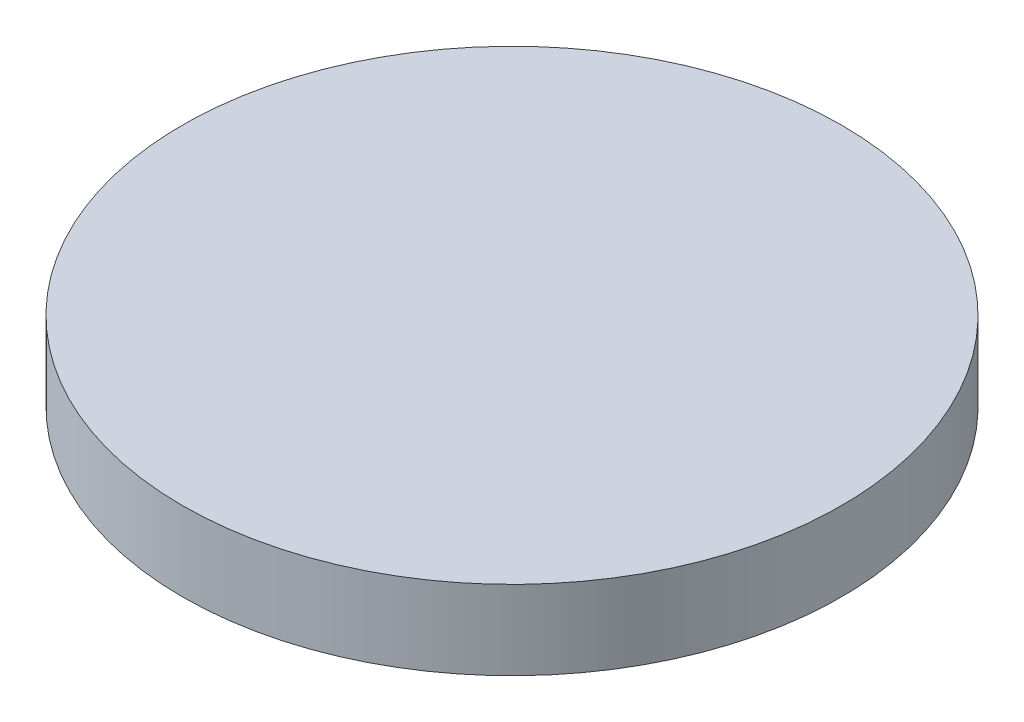
ISO-10303-21;
HEADER;
FILE_DESCRIPTION(('STEP AP214'),'2;1');
FILE_NAME('part.step','',(''),(''),'','','');
FILE_SCHEMA(('AUTOMOTIVE_DESIGN { 1 0 10303 214 1 1 1 1 }'));
ENDSEC;
DATA;
#1=APPLICATION_CONTEXT('core data for automotive mechanical design processes');
#2=APPLICATION_PROTOCOL_DEFINITION('international standard','automotive_design',2000,#1);
#3=PRODUCT_CONTEXT('',#1,'mechanical');
#4=PRODUCT('Part','Part','',(#3));
#5=PRODUCT_RELATED_PRODUCT_CATEGORY('part','',(#4));
#6=PRODUCT_DEFINITION_FORMATION('','',#4);
#7=PRODUCT_DEFINITION_CONTEXT('part definition',#1,'design');
#8=PRODUCT_DEFINITION('design','',#6,#7);
#9=PRODUCT_DEFINITION_SHAPE('','',#8);
#10=(LENGTH_UNIT() NAMED_UNIT(*) SI_UNIT(.MILLI.,.METRE.));
#11=(NAMED_UNIT(*) PLANE_ANGLE_UNIT() SI_UNIT($,.RADIAN.));
#12=(NAMED_UNIT(*) SI_UNIT($,.STERADIAN.) SOLID_ANGLE_UNIT());
#13=UNCERTAINTY_MEASURE_WITH_UNIT(LENGTH_MEASURE(1.E-05),#10,'distance_accuracy_value','');
#14=(GEOMETRIC_REPRESENTATION_CONTEXT(3) GLOBAL_UNCERTAINTY_ASSIGNED_CONTEXT((#13)) GLOBAL_UNIT_ASSIGNED_CONTEXT((#10,
#11,#12)) REPRESENTATION_CONTEXT('',''));
#15=CARTESIAN_POINT('',(0.,0.,0.));
#16=DIRECTION('',(0.,0.,1.));
#17=DIRECTION('',(1.,0.,0.));
#18=AXIS2_PLACEMENT_3D('',#15,#16,#17);
#19=CARTESIAN_POINT('',(31.476067469159,36.,-27.7416187863774));
#20=DIRECTION('',(0.,-1.,0.));
#21=DIRECTION('',(0.,0.,-1.));
#22=AXIS2_PLACEMENT_3D('',#19,#20,#21);
#23=CYLINDRICAL_SURFACE('',#22,150.);
#24=CARTESIAN_POINT('',(31.476067469159,36.,-27.7416187863774));
#25=DIRECTION('',(0.,1.,0.));
#26=DIRECTION('',(0.,0.,1.));
#27=AXIS2_PLACEMENT_3D('',#24,#25,#26);
#28=CIRCLE('',#27,150.);
#29=CARTESIAN_POINT('',(31.476067469159,36.,122.258381213623));
#30=VERTEX_POINT('',#29);
#31=EDGE_CURVE('E10',#30,#30,#28,.T.);
#32=ORIENTED_EDGE('',*,*,#31,.F.);
#33=EDGE_LOOP('',(#32));
#34=FACE_BOUND('',#33,.T.);
#35=CARTESIAN_POINT('',(31.476067469159,0.,-27.7416187863774));
#36=DIRECTION('',(0.,1.,0.));
#37=DIRECTION('',(0.,0.,1.));
#38=AXIS2_PLACEMENT_3D('',#35,#36,#37);
#39=CIRCLE('',#38,150.);
#40=CARTESIAN_POINT('',(31.476067469159,0.,122.258381213623));
#41=VERTEX_POINT('',#40);
#42=EDGE_CURVE('E33',#41,#41,#39,.T.);
#43=ORIENTED_EDGE('',*,*,#42,.T.);
#44=EDGE_LOOP('',(#43));
#45=FACE_BOUND('',#44,.T.);
#46=ADVANCED_FACE('F30',(#34,#45),#23,.T.);
#47=CARTESIAN_POINT('',(31.476067469159,36.,-27.7416187863774));
#48=DIRECTION('',(0.,1.,0.));
#49=DIRECTION('',(0.,0.,1.));
#50=AXIS2_PLACEMENT_3D('',#47,#48,#49);
#51=PLANE('',#50);
#52=ORIENTED_EDGE('',*,*,#31,.T.);
#53=EDGE_LOOP('',(#52));
#54=FACE_BOUND('',#53,.T.);
#55=ADVANCED_FACE('F45',(#54),#51,.T.);
#56=CARTESIAN_POINT('',(31.476067469159,0.,-27.7416187863774));
#57=DIRECTION('',(0.,1.,0.));
#58=DIRECTION('',(0.,0.,1.));
#59=AXIS2_PLACEMENT_3D('',#56,#57,#58);
#60=PLANE('',#59);
#61=ORIENTED_EDGE('',*,*,#42,.F.);
#62=EDGE_LOOP('',(#61));
#63=FACE_BOUND('',#62,.T.);
#64=ADVANCED_FACE('F43',(#63),#60,.F.);
#65=CLOSED_SHELL('',(#46,#55,#64));
#66=MANIFOLD_SOLID_BREP('B2',#65);
#67=ADVANCED_BREP_SHAPE_REPRESENTATION('',(#18,#66),#14);
#68=SHAPE_DEFINITION_REPRESENTATION(#9,#67);
ENDSEC;
END-ISO-10303-21;
